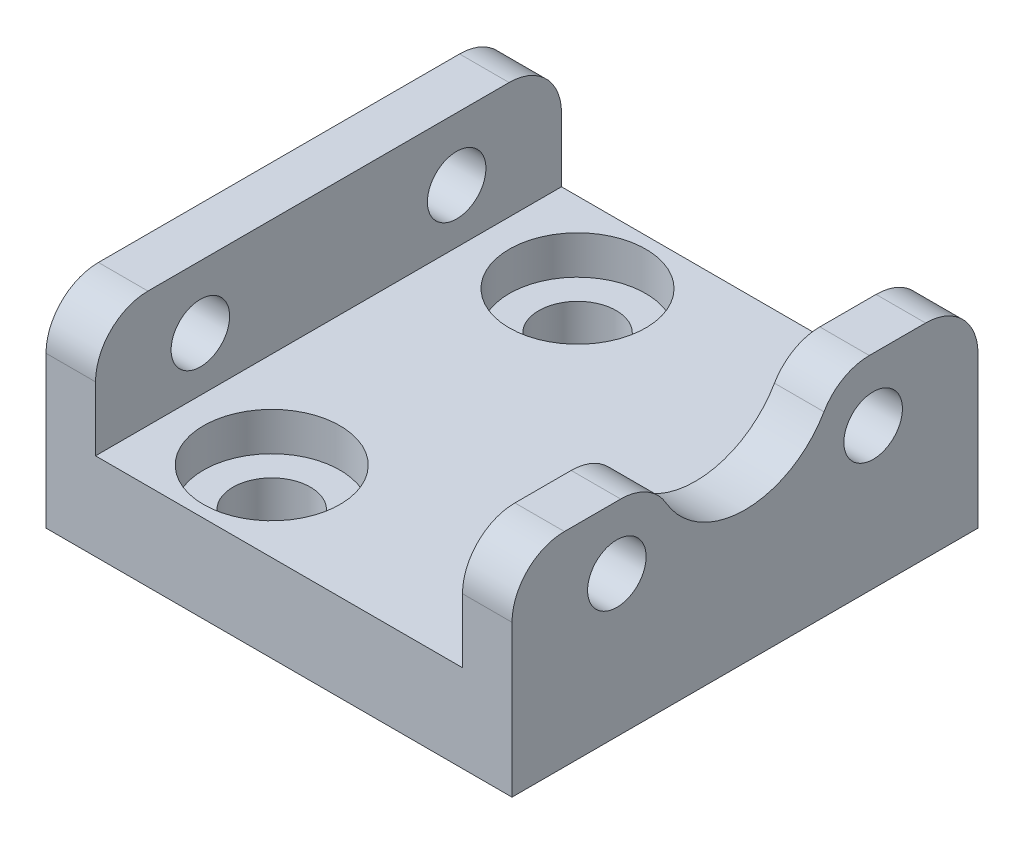
ISO-10303-21;
HEADER;
FILE_DESCRIPTION(('STEP AP214'),'2;1');
FILE_NAME('part.step','',(''),(''),'','','');
FILE_SCHEMA(('AUTOMOTIVE_DESIGN { 1 0 10303 214 1 1 1 1 }'));
ENDSEC;
DATA;
#1=APPLICATION_CONTEXT('core data for automotive mechanical design processes');
#2=APPLICATION_PROTOCOL_DEFINITION('international standard','automotive_design',2000,#1);
#3=PRODUCT_CONTEXT('',#1,'mechanical');
#4=PRODUCT('Part','Part','',(#3));
#5=PRODUCT_RELATED_PRODUCT_CATEGORY('part','',(#4));
#6=PRODUCT_DEFINITION_FORMATION('','',#4);
#7=PRODUCT_DEFINITION_CONTEXT('part definition',#1,'design');
#8=PRODUCT_DEFINITION('design','',#6,#7);
#9=PRODUCT_DEFINITION_SHAPE('','',#8);
#10=(LENGTH_UNIT() NAMED_UNIT(*) SI_UNIT(.MILLI.,.METRE.));
#11=(NAMED_UNIT(*) PLANE_ANGLE_UNIT() SI_UNIT($,.RADIAN.));
#12=(NAMED_UNIT(*) SI_UNIT($,.STERADIAN.) SOLID_ANGLE_UNIT());
#13=UNCERTAINTY_MEASURE_WITH_UNIT(LENGTH_MEASURE(1.E-05),#10,'distance_accuracy_value','');
#14=(GEOMETRIC_REPRESENTATION_CONTEXT(3) GLOBAL_UNCERTAINTY_ASSIGNED_CONTEXT((#13)) GLOBAL_UNIT_ASSIGNED_CONTEXT((#10,
#11,#12)) REPRESENTATION_CONTEXT('',''));
#15=CARTESIAN_POINT('',(0.,0.,0.));
#16=DIRECTION('',(0.,0.,1.));
#17=DIRECTION('',(1.,0.,0.));
#18=AXIS2_PLACEMENT_3D('',#15,#16,#17);
#19=CARTESIAN_POINT('',(0.,17.78,0.));
#20=DIRECTION('',(0.,1.,0.));
#21=DIRECTION('',(0.,0.,1.));
#22=AXIS2_PLACEMENT_3D('',#19,#20,#21);
#23=PLANE('',#22);
#24=DIRECTION('',(0.,0.,-1.));
#25=VECTOR('',#24,1.);
#26=CARTESIAN_POINT('',(40.64,17.78,0.));
#27=LINE('',#26,#25);
#28=CARTESIAN_POINT('',(40.64,17.78,36.068));
#29=VERTEX_POINT('',#28);
#30=CARTESIAN_POINT('',(40.64,17.78,31.1615412763114));
#31=VERTEX_POINT('',#30);
#32=EDGE_CURVE('E159',#29,#31,#27,.T.);
#33=ORIENTED_EDGE('',*,*,#32,.T.);
#34=DIRECTION('',(-1.,0.,0.));
#35=VECTOR('',#34,1.);
#36=CARTESIAN_POINT('',(36.322,17.78,31.1615412763114));
#37=LINE('',#36,#35);
#38=CARTESIAN_POINT('',(36.322,17.78,31.1615412763114));
#39=VERTEX_POINT('',#38);
#40=EDGE_CURVE('E223',#31,#39,#37,.T.);
#41=ORIENTED_EDGE('',*,*,#40,.T.);
#42=DIRECTION('',(0.,0.,1.));
#43=VECTOR('',#42,1.);
#44=CARTESIAN_POINT('',(36.322,17.78,0.));
#45=LINE('',#44,#43);
#46=CARTESIAN_POINT('',(36.322,17.78,36.068));
#47=VERTEX_POINT('',#46);
#48=EDGE_CURVE('E174',#39,#47,#45,.T.);
#49=ORIENTED_EDGE('',*,*,#48,.T.);
#50=DIRECTION('',(1.,0.,0.));
#51=VECTOR('',#50,1.);
#52=CARTESIAN_POINT('',(40.64,17.78,36.068));
#53=LINE('',#52,#51);
#54=EDGE_CURVE('E217',#47,#29,#53,.T.);
#55=ORIENTED_EDGE('',*,*,#54,.T.);
#56=EDGE_LOOP('',(#33,#41,#49,#55));
#57=FACE_BOUND('',#56,.T.);
#58=ADVANCED_FACE('F34',(#57),#23,.T.);
#59=CARTESIAN_POINT('',(0.,7.62,0.));
#60=DIRECTION('',(0.,1.,0.));
#61=DIRECTION('',(0.,0.,1.));
#62=AXIS2_PLACEMENT_3D('',#59,#60,#61);
#63=PLANE('',#62);
#64=CARTESIAN_POINT('',(12.7,7.62,6.985));
#65=DIRECTION('',(0.,1.,0.));
#66=DIRECTION('',(0.,0.,1.));
#67=AXIS2_PLACEMENT_3D('',#64,#65,#66);
#68=CIRCLE('',#67,5.95376);
#69=CARTESIAN_POINT('',(12.7,7.62,12.93876));
#70=VERTEX_POINT('',#69);
#71=EDGE_CURVE('E314',#70,#70,#68,.T.);
#72=ORIENTED_EDGE('',*,*,#71,.F.);
#73=EDGE_LOOP('',(#72));
#74=FACE_BOUND('',#73,.T.);
#75=CARTESIAN_POINT('',(12.7,7.62,33.655));
#76=DIRECTION('',(0.,1.,0.));
#77=DIRECTION('',(0.,0.,1.));
#78=AXIS2_PLACEMENT_3D('',#75,#76,#77);
#79=CIRCLE('',#78,5.95376);
#80=CARTESIAN_POINT('',(12.7,7.62,39.60876));
#81=VERTEX_POINT('',#80);
#82=EDGE_CURVE('E330',#81,#81,#79,.T.);
#83=ORIENTED_EDGE('',*,*,#82,.F.);
#84=EDGE_LOOP('',(#83));
#85=FACE_BOUND('',#84,.T.);
#86=DIRECTION('',(1.,0.,0.));
#87=VECTOR('',#86,1.);
#88=CARTESIAN_POINT('',(0.,7.62,40.64));
#89=LINE('',#88,#87);
#90=CARTESIAN_POINT('',(4.31800000000001,7.62,40.64));
#91=VERTEX_POINT('',#90);
#92=CARTESIAN_POINT('',(36.322,7.62,40.64));
#93=VERTEX_POINT('',#92);
#94=EDGE_CURVE('E169',#91,#93,#89,.T.);
#95=ORIENTED_EDGE('',*,*,#94,.T.);
#96=DIRECTION('',(0.,0.,1.));
#97=VECTOR('',#96,1.);
#98=CARTESIAN_POINT('',(36.322,7.62,0.));
#99=LINE('',#98,#97);
#100=CARTESIAN_POINT('',(36.322,7.62,0.));
#101=VERTEX_POINT('',#100);
#102=EDGE_CURVE('E153',#101,#93,#99,.T.);
#103=ORIENTED_EDGE('',*,*,#102,.F.);
#104=DIRECTION('',(-1.,0.,0.));
#105=VECTOR('',#104,1.);
#106=CARTESIAN_POINT('',(0.,7.62,0.));
#107=LINE('',#106,#105);
#108=CARTESIAN_POINT('',(4.31800000000001,7.62,0.));
#109=VERTEX_POINT('',#108);
#110=EDGE_CURVE('E162',#101,#109,#107,.T.);
#111=ORIENTED_EDGE('',*,*,#110,.T.);
#112=DIRECTION('',(0.,0.,-1.));
#113=VECTOR('',#112,1.);
#114=CARTESIAN_POINT('',(4.31800000000001,7.62,0.));
#115=LINE('',#114,#113);
#116=EDGE_CURVE('E187',#91,#109,#115,.T.);
#117=ORIENTED_EDGE('',*,*,#116,.F.);
#118=EDGE_LOOP('',(#95,#103,#111,#117));
#119=FACE_BOUND('',#118,.T.);
#120=ADVANCED_FACE('F172',(#74,#85,#119),#63,.T.);
#121=CARTESIAN_POINT('',(0.,7.62,0.));
#122=DIRECTION('',(1.,0.,0.));
#123=DIRECTION('',(0.,0.,-1.));
#124=AXIS2_PLACEMENT_3D('',#121,#122,#123);
#125=PLANE('',#124);
#126=CARTESIAN_POINT('',(0.,12.3189999999999,9.14399999999984));
#127=DIRECTION('',(-1.,0.,0.));
#128=DIRECTION('',(0.,0.,1.));
#129=AXIS2_PLACEMENT_3D('',#126,#127,#128);
#130=CIRCLE('',#129,2.5527);
#131=CARTESIAN_POINT('',(0.,12.3189999999999,11.6966999999998));
#132=VERTEX_POINT('',#131);
#133=EDGE_CURVE('E342',#132,#132,#130,.T.);
#134=ORIENTED_EDGE('',*,*,#133,.F.);
#135=EDGE_LOOP('',(#134));
#136=FACE_BOUND('',#135,.T.);
#137=CARTESIAN_POINT('',(0.,12.319,31.496));
#138=DIRECTION('',(-1.,0.,0.));
#139=DIRECTION('',(0.,0.,1.));
#140=AXIS2_PLACEMENT_3D('',#137,#138,#139);
#141=CIRCLE('',#140,2.5527);
#142=CARTESIAN_POINT('',(0.,12.319,34.0487));
#143=VERTEX_POINT('',#142);
#144=EDGE_CURVE('E354',#143,#143,#141,.T.);
#145=ORIENTED_EDGE('',*,*,#144,.F.);
#146=EDGE_LOOP('',(#145));
#147=FACE_BOUND('',#146,.T.);
#148=DIRECTION('',(0.,0.,1.));
#149=VECTOR('',#148,1.);
#150=CARTESIAN_POINT('',(0.,17.78,0.));
#151=LINE('',#150,#149);
#152=CARTESIAN_POINT('',(0.,17.78,4.572));
#153=VERTEX_POINT('',#152);
#154=CARTESIAN_POINT('',(0.,17.78,36.068));
#155=VERTEX_POINT('',#154);
#156=EDGE_CURVE('E188',#153,#155,#151,.T.);
#157=ORIENTED_EDGE('',*,*,#156,.F.);
#158=CARTESIAN_POINT('',(0.,13.208,4.572));
#159=DIRECTION('',(1.,0.,0.));
#160=DIRECTION('',(0.,0.,-1.));
#161=AXIS2_PLACEMENT_3D('',#158,#159,#160);
#162=CIRCLE('',#161,4.572);
#163=CARTESIAN_POINT('',(0.,13.208,0.));
#164=VERTEX_POINT('',#163);
#165=EDGE_CURVE('E266',#153,#164,#162,.F.);
#166=ORIENTED_EDGE('',*,*,#165,.T.);
#167=DIRECTION('',(0.,-1.,0.));
#168=VECTOR('',#167,1.);
#169=CARTESIAN_POINT('',(0.,7.62,0.));
#170=LINE('',#169,#168);
#171=CARTESIAN_POINT('',(0.,0.,0.));
#172=VERTEX_POINT('',#171);
#173=EDGE_CURVE('E168',#164,#172,#170,.T.);
#174=ORIENTED_EDGE('',*,*,#173,.T.);
#175=DIRECTION('',(0.,0.,1.));
#176=VECTOR('',#175,1.);
#177=CARTESIAN_POINT('',(0.,0.,0.));
#178=LINE('',#177,#176);
#179=CARTESIAN_POINT('',(0.,0.,40.64));
#180=VERTEX_POINT('',#179);
#181=EDGE_CURVE('E197',#172,#180,#178,.T.);
#182=ORIENTED_EDGE('',*,*,#181,.T.);
#183=DIRECTION('',(0.,-1.,0.));
#184=VECTOR('',#183,1.);
#185=CARTESIAN_POINT('',(0.,7.62,40.64));
#186=LINE('',#185,#184);
#187=CARTESIAN_POINT('',(0.,13.208,40.64));
#188=VERTEX_POINT('',#187);
#189=EDGE_CURVE('E215',#188,#180,#186,.T.);
#190=ORIENTED_EDGE('',*,*,#189,.F.);
#191=CARTESIAN_POINT('',(0.,13.208,36.068));
#192=DIRECTION('',(1.,0.,0.));
#193=DIRECTION('',(0.,0.,-1.));
#194=AXIS2_PLACEMENT_3D('',#191,#192,#193);
#195=CIRCLE('',#194,4.572);
#196=EDGE_CURVE('E264',#188,#155,#195,.F.);
#197=ORIENTED_EDGE('',*,*,#196,.T.);
#198=EDGE_LOOP('',(#157,#166,#174,#182,#190,#197));
#199=FACE_BOUND('',#198,.T.);
#200=ADVANCED_FACE('F276',(#136,#147,#199),#125,.F.);
#201=CARTESIAN_POINT('',(0.,7.62,40.64));
#202=DIRECTION('',(0.,0.,-1.));
#203=DIRECTION('',(-1.,0.,0.));
#204=AXIS2_PLACEMENT_3D('',#201,#202,#203);
#205=PLANE('',#204);
#206=DIRECTION('',(0.,-1.,0.));
#207=VECTOR('',#206,1.);
#208=CARTESIAN_POINT('',(40.64,7.62,40.64));
#209=LINE('',#208,#207);
#210=CARTESIAN_POINT('',(40.64,13.208,40.64));
#211=VERTEX_POINT('',#210);
#212=CARTESIAN_POINT('',(40.64,0.,40.64));
#213=VERTEX_POINT('',#212);
#214=EDGE_CURVE('E213',#211,#213,#209,.T.);
#215=ORIENTED_EDGE('',*,*,#214,.F.);
#216=DIRECTION('',(1.,0.,0.));
#217=VECTOR('',#216,1.);
#218=CARTESIAN_POINT('',(36.322,13.208,40.64));
#219=LINE('',#218,#217);
#220=CARTESIAN_POINT('',(36.322,13.208,40.64));
#221=VERTEX_POINT('',#220);
#222=EDGE_CURVE('E257',#211,#221,#219,.F.);
#223=ORIENTED_EDGE('',*,*,#222,.T.);
#224=DIRECTION('',(0.,-1.,0.));
#225=VECTOR('',#224,1.);
#226=CARTESIAN_POINT('',(36.322,17.78,40.64));
#227=LINE('',#226,#225);
#228=EDGE_CURVE('E158',#221,#93,#227,.T.);
#229=ORIENTED_EDGE('',*,*,#228,.T.);
#230=ORIENTED_EDGE('',*,*,#94,.F.);
#231=DIRECTION('',(0.,-1.,0.));
#232=VECTOR('',#231,1.);
#233=CARTESIAN_POINT('',(4.31800000000001,17.78,40.64));
#234=LINE('',#233,#232);
#235=CARTESIAN_POINT('',(4.31800000000001,13.208,40.64));
#236=VERTEX_POINT('',#235);
#237=EDGE_CURVE('E195',#236,#91,#234,.T.);
#238=ORIENTED_EDGE('',*,*,#237,.F.);
#239=DIRECTION('',(1.,0.,0.));
#240=VECTOR('',#239,1.);
#241=CARTESIAN_POINT('',(0.,13.208,40.64));
#242=LINE('',#241,#240);
#243=EDGE_CURVE('E255',#236,#188,#242,.F.);
#244=ORIENTED_EDGE('',*,*,#243,.T.);
#245=ORIENTED_EDGE('',*,*,#189,.T.);
#246=DIRECTION('',(1.,0.,0.));
#247=VECTOR('',#246,1.);
#248=CARTESIAN_POINT('',(0.,0.,40.64));
#249=LINE('',#248,#247);
#250=EDGE_CURVE('E202',#180,#213,#249,.T.);
#251=ORIENTED_EDGE('',*,*,#250,.T.);
#252=EDGE_LOOP('',(#215,#223,#229,#230,#238,#244,#245,#251));
#253=FACE_BOUND('',#252,.T.);
#254=ADVANCED_FACE('F271',(#253),#205,.F.);
#255=CARTESIAN_POINT('',(40.64,7.62,0.));
#256=DIRECTION('',(-1.,0.,0.));
#257=DIRECTION('',(0.,0.,1.));
#258=AXIS2_PLACEMENT_3D('',#255,#256,#257);
#259=PLANE('',#258);
#260=CARTESIAN_POINT('',(40.64,12.3189999999999,9.14399999999983));
#261=DIRECTION('',(-1.,0.,0.));
#262=DIRECTION('',(0.,0.,1.));
#263=AXIS2_PLACEMENT_3D('',#260,#261,#262);
#264=CIRCLE('',#263,2.55269999999999);
#265=CARTESIAN_POINT('',(40.64,12.3189999999999,11.6966999999998));
#266=VERTEX_POINT('',#265);
#267=EDGE_CURVE('E345',#266,#266,#264,.T.);
#268=ORIENTED_EDGE('',*,*,#267,.T.);
#269=EDGE_LOOP('',(#268));
#270=FACE_BOUND('',#269,.T.);
#271=CARTESIAN_POINT('',(40.64,12.319,31.496));
#272=DIRECTION('',(-1.,0.,0.));
#273=DIRECTION('',(0.,0.,1.));
#274=AXIS2_PLACEMENT_3D('',#271,#272,#273);
#275=CIRCLE('',#274,2.55269999999999);
#276=CARTESIAN_POINT('',(40.64,12.319,34.0487));
#277=VERTEX_POINT('',#276);
#278=EDGE_CURVE('E220',#277,#277,#275,.T.);
#279=ORIENTED_EDGE('',*,*,#278,.T.);
#280=EDGE_LOOP('',(#279));
#281=FACE_BOUND('',#280,.T.);
#282=CARTESIAN_POINT('',(40.64,19.5045530119415,20.32));
#283=DIRECTION('',(1.,0.,0.));
#284=DIRECTION('',(0.,0.,-1.));
#285=AXIS2_PLACEMENT_3D('',#282,#283,#284);
#286=CIRCLE('',#285,7.96536802834442);
#287=CARTESIAN_POINT('',(40.64,15.5041629829732,27.207958147601));
#288=VERTEX_POINT('',#287);
#289=CARTESIAN_POINT('',(40.64,15.5041629829732,13.432041852399));
#290=VERTEX_POINT('',#289);
#291=EDGE_CURVE('E315',#288,#290,#286,.T.);
#292=ORIENTED_EDGE('',*,*,#291,.F.);
#293=CARTESIAN_POINT('',(40.64,13.208,31.1615412763114));
#294=DIRECTION('',(-1.,0.,0.));
#295=DIRECTION('',(0.,0.,1.));
#296=AXIS2_PLACEMENT_3D('',#293,#294,#295);
#297=CIRCLE('',#296,4.572);
#298=EDGE_CURVE('E243',#288,#31,#297,.F.);
#299=ORIENTED_EDGE('',*,*,#298,.T.);
#300=ORIENTED_EDGE('',*,*,#32,.F.);
#301=CARTESIAN_POINT('',(40.64,13.208,36.068));
#302=DIRECTION('',(-1.,0.,0.));
#303=DIRECTION('',(0.,0.,1.));
#304=AXIS2_PLACEMENT_3D('',#301,#302,#303);
#305=CIRCLE('',#304,4.572);
#306=EDGE_CURVE('E237',#29,#211,#305,.F.);
#307=ORIENTED_EDGE('',*,*,#306,.T.);
#308=ORIENTED_EDGE('',*,*,#214,.T.);
#309=DIRECTION('',(0.,0.,-1.));
#310=VECTOR('',#309,1.);
#311=CARTESIAN_POINT('',(40.64,0.,0.));
#312=LINE('',#311,#310);
#313=CARTESIAN_POINT('',(40.64,0.,0.));
#314=VERTEX_POINT('',#313);
#315=EDGE_CURVE('E205',#213,#314,#312,.T.);
#316=ORIENTED_EDGE('',*,*,#315,.T.);
#317=DIRECTION('',(0.,-1.,0.));
#318=VECTOR('',#317,1.);
#319=CARTESIAN_POINT('',(40.64,7.62,0.));
#320=LINE('',#319,#318);
#321=CARTESIAN_POINT('',(40.64,13.208,0.));
#322=VERTEX_POINT('',#321);
#323=EDGE_CURVE('E211',#322,#314,#320,.T.);
#324=ORIENTED_EDGE('',*,*,#323,.F.);
#325=CARTESIAN_POINT('',(40.64,13.208,4.572));
#326=DIRECTION('',(-1.,0.,0.));
#327=DIRECTION('',(0.,0.,1.));
#328=AXIS2_PLACEMENT_3D('',#325,#326,#327);
#329=CIRCLE('',#328,4.572);
#330=CARTESIAN_POINT('',(40.64,17.78,4.572));
#331=VERTEX_POINT('',#330);
#332=EDGE_CURVE('E239',#322,#331,#329,.F.);
#333=ORIENTED_EDGE('',*,*,#332,.T.);
#334=CARTESIAN_POINT('',(40.64,17.78,9.47845872368865));
#335=VERTEX_POINT('',#334);
#336=EDGE_CURVE('E184',#335,#331,#27,.T.);
#337=ORIENTED_EDGE('',*,*,#336,.F.);
#338=CARTESIAN_POINT('',(40.64,13.208,9.47845872368865));
#339=DIRECTION('',(-1.,0.,0.));
#340=DIRECTION('',(0.,0.,1.));
#341=AXIS2_PLACEMENT_3D('',#338,#339,#340);
#342=CIRCLE('',#341,4.572);
#343=EDGE_CURVE('E241',#335,#290,#342,.F.);
#344=ORIENTED_EDGE('',*,*,#343,.T.);
#345=EDGE_LOOP('',(#292,#299,#300,#307,#308,#316,#324,#333,#337,#344));
#346=FACE_BOUND('',#345,.T.);
#347=ADVANCED_FACE('F368',(#270,#281,#346),#259,.F.);
#348=CARTESIAN_POINT('',(0.,7.62,0.));
#349=DIRECTION('',(0.,0.,1.));
#350=DIRECTION('',(1.,0.,0.));
#351=AXIS2_PLACEMENT_3D('',#348,#349,#350);
#352=PLANE('',#351);
#353=DIRECTION('',(0.,-1.,0.));
#354=VECTOR('',#353,1.);
#355=CARTESIAN_POINT('',(36.322,17.78,0.));
#356=LINE('',#355,#354);
#357=CARTESIAN_POINT('',(36.322,13.208,0.));
#358=VERTEX_POINT('',#357);
#359=EDGE_CURVE('E147',#358,#101,#356,.T.);
#360=ORIENTED_EDGE('',*,*,#359,.F.);
#361=DIRECTION('',(-1.,0.,0.));
#362=VECTOR('',#361,1.);
#363=CARTESIAN_POINT('',(40.64,13.208,0.));
#364=LINE('',#363,#362);
#365=EDGE_CURVE('E253',#358,#322,#364,.F.);
#366=ORIENTED_EDGE('',*,*,#365,.T.);
#367=ORIENTED_EDGE('',*,*,#323,.T.);
#368=DIRECTION('',(-1.,0.,0.));
#369=VECTOR('',#368,1.);
#370=CARTESIAN_POINT('',(0.,0.,0.));
#371=LINE('',#370,#369);
#372=EDGE_CURVE('E198',#314,#172,#371,.T.);
#373=ORIENTED_EDGE('',*,*,#372,.T.);
#374=ORIENTED_EDGE('',*,*,#173,.F.);
#375=DIRECTION('',(-1.,0.,0.));
#376=VECTOR('',#375,1.);
#377=CARTESIAN_POINT('',(4.31800000000001,13.208,0.));
#378=LINE('',#377,#376);
#379=CARTESIAN_POINT('',(4.31800000000001,13.208,0.));
#380=VERTEX_POINT('',#379);
#381=EDGE_CURVE('E251',#164,#380,#378,.F.);
#382=ORIENTED_EDGE('',*,*,#381,.T.);
#383=DIRECTION('',(0.,-1.,0.));
#384=VECTOR('',#383,1.);
#385=CARTESIAN_POINT('',(4.31800000000001,17.78,0.));
#386=LINE('',#385,#384);
#387=EDGE_CURVE('E164',#380,#109,#386,.T.);
#388=ORIENTED_EDGE('',*,*,#387,.T.);
#389=ORIENTED_EDGE('',*,*,#110,.F.);
#390=EDGE_LOOP('',(#360,#366,#367,#373,#374,#382,#388,#389));
#391=FACE_BOUND('',#390,.T.);
#392=ADVANCED_FACE('F163',(#391),#352,.F.);
#393=CARTESIAN_POINT('',(0.,0.,0.));
#394=DIRECTION('',(0.,1.,0.));
#395=DIRECTION('',(0.,0.,1.));
#396=AXIS2_PLACEMENT_3D('',#393,#394,#395);
#397=PLANE('',#396);
#398=CARTESIAN_POINT('',(12.7,0.,6.985));
#399=DIRECTION('',(0.,1.,0.));
#400=DIRECTION('',(0.,0.,1.));
#401=AXIS2_PLACEMENT_3D('',#398,#399,#400);
#402=CIRCLE('',#401,3.3782);
#403=CARTESIAN_POINT('',(12.7,0.,10.3632));
#404=VERTEX_POINT('',#403);
#405=EDGE_CURVE('E327',#404,#404,#402,.T.);
#406=ORIENTED_EDGE('',*,*,#405,.T.);
#407=EDGE_LOOP('',(#406));
#408=FACE_BOUND('',#407,.T.);
#409=CARTESIAN_POINT('',(12.7,0.,33.655));
#410=DIRECTION('',(0.,1.,0.));
#411=DIRECTION('',(0.,0.,1.));
#412=AXIS2_PLACEMENT_3D('',#409,#410,#411);
#413=CIRCLE('',#412,3.3782);
#414=CARTESIAN_POINT('',(12.7,0.,37.0332));
#415=VERTEX_POINT('',#414);
#416=EDGE_CURVE('E339',#415,#415,#413,.T.);
#417=ORIENTED_EDGE('',*,*,#416,.T.);
#418=EDGE_LOOP('',(#417));
#419=FACE_BOUND('',#418,.T.);
#420=ORIENTED_EDGE('',*,*,#181,.F.);
#421=ORIENTED_EDGE('',*,*,#372,.F.);
#422=ORIENTED_EDGE('',*,*,#315,.F.);
#423=ORIENTED_EDGE('',*,*,#250,.F.);
#424=EDGE_LOOP('',(#420,#421,#422,#423));
#425=FACE_BOUND('',#424,.T.);
#426=ADVANCED_FACE('F290',(#408,#419,#425),#397,.F.);
#427=CARTESIAN_POINT('',(4.31800000000001,17.78,0.));
#428=DIRECTION('',(-1.,0.,0.));
#429=DIRECTION('',(0.,0.,1.));
#430=AXIS2_PLACEMENT_3D('',#427,#428,#429);
#431=PLANE('',#430);
#432=CARTESIAN_POINT('',(4.31800000000001,12.3189999999999,9.14399999999984));
#433=DIRECTION('',(-1.,0.,0.));
#434=DIRECTION('',(0.,0.,1.));
#435=AXIS2_PLACEMENT_3D('',#432,#433,#434);
#436=CIRCLE('',#435,2.5527);
#437=CARTESIAN_POINT('',(4.31800000000001,12.3189999999999,11.6966999999998));
#438=VERTEX_POINT('',#437);
#439=EDGE_CURVE('E348',#438,#438,#436,.T.);
#440=ORIENTED_EDGE('',*,*,#439,.T.);
#441=EDGE_LOOP('',(#440));
#442=FACE_BOUND('',#441,.T.);
#443=CARTESIAN_POINT('',(4.31800000000001,12.319,31.496));
#444=DIRECTION('',(-1.,0.,0.));
#445=DIRECTION('',(0.,0.,1.));
#446=AXIS2_PLACEMENT_3D('',#443,#444,#445);
#447=CIRCLE('',#446,2.5527);
#448=CARTESIAN_POINT('',(4.31800000000001,12.319,34.0487));
#449=VERTEX_POINT('',#448);
#450=EDGE_CURVE('E181',#449,#449,#447,.T.);
#451=ORIENTED_EDGE('',*,*,#450,.T.);
#452=EDGE_LOOP('',(#451));
#453=FACE_BOUND('',#452,.T.);
#454=ORIENTED_EDGE('',*,*,#387,.F.);
#455=CARTESIAN_POINT('',(4.31800000000001,13.208,4.572));
#456=DIRECTION('',(-1.,0.,0.));
#457=DIRECTION('',(0.,0.,1.));
#458=AXIS2_PLACEMENT_3D('',#455,#456,#457);
#459=CIRCLE('',#458,4.572);
#460=CARTESIAN_POINT('',(4.31800000000001,17.78,4.572));
#461=VERTEX_POINT('',#460);
#462=EDGE_CURVE('E11',#380,#461,#459,.F.);
#463=ORIENTED_EDGE('',*,*,#462,.T.);
#464=DIRECTION('',(0.,0.,-1.));
#465=VECTOR('',#464,1.);
#466=CARTESIAN_POINT('',(4.31800000000001,17.78,0.));
#467=LINE('',#466,#465);
#468=CARTESIAN_POINT('',(4.31800000000001,17.78,36.068));
#469=VERTEX_POINT('',#468);
#470=EDGE_CURVE('E191',#469,#461,#467,.T.);
#471=ORIENTED_EDGE('',*,*,#470,.F.);
#472=CARTESIAN_POINT('',(4.31800000000001,13.208,36.068));
#473=DIRECTION('',(-1.,0.,0.));
#474=DIRECTION('',(0.,0.,1.));
#475=AXIS2_PLACEMENT_3D('',#472,#473,#474);
#476=CIRCLE('',#475,4.572);
#477=EDGE_CURVE('E42',#469,#236,#476,.F.);
#478=ORIENTED_EDGE('',*,*,#477,.T.);
#479=ORIENTED_EDGE('',*,*,#237,.T.);
#480=ORIENTED_EDGE('',*,*,#116,.T.);
#481=EDGE_LOOP('',(#454,#463,#471,#478,#479,#480));
#482=FACE_BOUND('',#481,.T.);
#483=ADVANCED_FACE('F268',(#442,#453,#482),#431,.F.);
#484=CARTESIAN_POINT('',(0.,17.78,0.));
#485=DIRECTION('',(0.,1.,0.));
#486=DIRECTION('',(0.,0.,1.));
#487=AXIS2_PLACEMENT_3D('',#484,#485,#486);
#488=PLANE('',#487);
#489=ORIENTED_EDGE('',*,*,#470,.T.);
#490=DIRECTION('',(-1.,0.,0.));
#491=VECTOR('',#490,1.);
#492=CARTESIAN_POINT('',(0.,17.78,4.572));
#493=LINE('',#492,#491);
#494=EDGE_CURVE('E261',#461,#153,#493,.T.);
#495=ORIENTED_EDGE('',*,*,#494,.T.);
#496=ORIENTED_EDGE('',*,*,#156,.T.);
#497=DIRECTION('',(1.,0.,0.));
#498=VECTOR('',#497,1.);
#499=CARTESIAN_POINT('',(4.31800000000001,17.78,36.068));
#500=LINE('',#499,#498);
#501=EDGE_CURVE('E259',#155,#469,#500,.T.);
#502=ORIENTED_EDGE('',*,*,#501,.T.);
#503=EDGE_LOOP('',(#489,#495,#496,#502));
#504=FACE_BOUND('',#503,.T.);
#505=ADVANCED_FACE('F278',(#504),#488,.T.);
#506=CARTESIAN_POINT('',(36.322,17.78,0.));
#507=DIRECTION('',(1.,0.,0.));
#508=DIRECTION('',(0.,0.,-1.));
#509=AXIS2_PLACEMENT_3D('',#506,#507,#508);
#510=PLANE('',#509);
#511=CARTESIAN_POINT('',(36.322,12.3189999999999,9.14399999999983));
#512=DIRECTION('',(1.,0.,0.));
#513=DIRECTION('',(0.,0.,-1.));
#514=AXIS2_PLACEMENT_3D('',#511,#512,#513);
#515=CIRCLE('',#514,2.5527);
#516=CARTESIAN_POINT('',(36.322,12.3189999999999,6.59129999999984));
#517=VERTEX_POINT('',#516);
#518=EDGE_CURVE('E351',#517,#517,#515,.T.);
#519=ORIENTED_EDGE('',*,*,#518,.T.);
#520=EDGE_LOOP('',(#519));
#521=FACE_BOUND('',#520,.T.);
#522=CARTESIAN_POINT('',(36.322,12.319,31.496));
#523=DIRECTION('',(1.,0.,0.));
#524=DIRECTION('',(0.,0.,-1.));
#525=AXIS2_PLACEMENT_3D('',#522,#523,#524);
#526=CIRCLE('',#525,2.5527);
#527=CARTESIAN_POINT('',(36.322,12.319,28.9433));
#528=VERTEX_POINT('',#527);
#529=EDGE_CURVE('E175',#528,#528,#526,.T.);
#530=ORIENTED_EDGE('',*,*,#529,.T.);
#531=EDGE_LOOP('',(#530));
#532=FACE_BOUND('',#531,.T.);
#533=ORIENTED_EDGE('',*,*,#48,.F.);
#534=CARTESIAN_POINT('',(36.322,13.208,31.1615412763114));
#535=DIRECTION('',(1.,0.,0.));
#536=DIRECTION('',(0.,0.,-1.));
#537=AXIS2_PLACEMENT_3D('',#534,#535,#536);
#538=CIRCLE('',#537,4.572);
#539=CARTESIAN_POINT('',(36.322,15.5041629829732,27.207958147601));
#540=VERTEX_POINT('',#539);
#541=EDGE_CURVE('E231',#39,#540,#538,.F.);
#542=ORIENTED_EDGE('',*,*,#541,.T.);
#543=CARTESIAN_POINT('',(36.322,19.5045530119415,20.32));
#544=DIRECTION('',(1.,0.,0.));
#545=DIRECTION('',(0.,0.,-1.));
#546=AXIS2_PLACEMENT_3D('',#543,#544,#545);
#547=CIRCLE('',#546,7.96536802834442);
#548=CARTESIAN_POINT('',(36.322,15.5041629829732,13.432041852399));
#549=VERTEX_POINT('',#548);
#550=EDGE_CURVE('E307',#549,#540,#547,.F.);
#551=ORIENTED_EDGE('',*,*,#550,.F.);
#552=CARTESIAN_POINT('',(36.322,13.208,9.47845872368865));
#553=DIRECTION('',(1.,0.,0.));
#554=DIRECTION('',(0.,0.,-1.));
#555=AXIS2_PLACEMENT_3D('',#552,#553,#554);
#556=CIRCLE('',#555,4.572);
#557=CARTESIAN_POINT('',(36.322,17.78,9.47845872368865));
#558=VERTEX_POINT('',#557);
#559=EDGE_CURVE('E229',#549,#558,#556,.F.);
#560=ORIENTED_EDGE('',*,*,#559,.T.);
#561=CARTESIAN_POINT('',(36.322,17.78,4.572));
#562=VERTEX_POINT('',#561);
#563=EDGE_CURVE('E178',#562,#558,#45,.T.);
#564=ORIENTED_EDGE('',*,*,#563,.F.);
#565=CARTESIAN_POINT('',(36.322,13.208,4.572));
#566=DIRECTION('',(1.,0.,0.));
#567=DIRECTION('',(0.,0.,-1.));
#568=AXIS2_PLACEMENT_3D('',#565,#566,#567);
#569=CIRCLE('',#568,4.572);
#570=EDGE_CURVE('E155',#562,#358,#569,.F.);
#571=ORIENTED_EDGE('',*,*,#570,.T.);
#572=ORIENTED_EDGE('',*,*,#359,.T.);
#573=ORIENTED_EDGE('',*,*,#102,.T.);
#574=ORIENTED_EDGE('',*,*,#228,.F.);
#575=CARTESIAN_POINT('',(36.322,13.208,36.068));
#576=DIRECTION('',(1.,0.,0.));
#577=DIRECTION('',(0.,0.,-1.));
#578=AXIS2_PLACEMENT_3D('',#575,#576,#577);
#579=CIRCLE('',#578,4.572);
#580=EDGE_CURVE('E226',#221,#47,#579,.F.);
#581=ORIENTED_EDGE('',*,*,#580,.T.);
#582=EDGE_LOOP('',(#533,#542,#551,#560,#564,#571,#572,#573,#574,#581));
#583=FACE_BOUND('',#582,.T.);
#584=ADVANCED_FACE('F150',(#521,#532,#583),#510,.F.);
#585=ORIENTED_EDGE('',*,*,#563,.T.);
#586=DIRECTION('',(-1.,0.,0.));
#587=VECTOR('',#586,1.);
#588=CARTESIAN_POINT('',(40.64,17.78,9.47845872368865));
#589=LINE('',#588,#587);
#590=EDGE_CURVE('E248',#558,#335,#589,.F.);
#591=ORIENTED_EDGE('',*,*,#590,.T.);
#592=ORIENTED_EDGE('',*,*,#336,.T.);
#593=DIRECTION('',(-1.,0.,0.));
#594=VECTOR('',#593,1.);
#595=CARTESIAN_POINT('',(36.322,17.78,4.572));
#596=LINE('',#595,#594);
#597=EDGE_CURVE('E245',#331,#562,#596,.T.);
#598=ORIENTED_EDGE('',*,*,#597,.T.);
#599=EDGE_LOOP('',(#585,#591,#592,#598));
#600=FACE_BOUND('',#599,.T.);
#601=ADVANCED_FACE('F364',(#600),#23,.T.);
#602=CARTESIAN_POINT('',(0.,12.319,31.496));
#603=DIRECTION('',(-1.,0.,0.));
#604=DIRECTION('',(0.,0.,1.));
#605=AXIS2_PLACEMENT_3D('',#602,#603,#604);
#606=CYLINDRICAL_SURFACE('',#605,2.5527);
#607=ORIENTED_EDGE('',*,*,#144,.T.);
#608=EDGE_LOOP('',(#607));
#609=FACE_BOUND('',#608,.T.);
#610=ORIENTED_EDGE('',*,*,#450,.F.);
#611=EDGE_LOOP('',(#610));
#612=FACE_BOUND('',#611,.T.);
#613=ADVANCED_FACE('F389',(#609,#612),#606,.F.);
#614=ORIENTED_EDGE('',*,*,#278,.F.);
#615=EDGE_LOOP('',(#614));
#616=FACE_BOUND('',#615,.T.);
#617=ORIENTED_EDGE('',*,*,#529,.F.);
#618=EDGE_LOOP('',(#617));
#619=FACE_BOUND('',#618,.T.);
#620=ADVANCED_FACE('F394',(#616,#619),#606,.F.);
#621=CARTESIAN_POINT('',(0.,12.3189999999999,9.14399999999984));
#622=DIRECTION('',(-1.,0.,0.));
#623=DIRECTION('',(0.,0.,1.));
#624=AXIS2_PLACEMENT_3D('',#621,#622,#623);
#625=CYLINDRICAL_SURFACE('',#624,2.5527);
#626=ORIENTED_EDGE('',*,*,#267,.F.);
#627=EDGE_LOOP('',(#626));
#628=FACE_BOUND('',#627,.T.);
#629=ORIENTED_EDGE('',*,*,#518,.F.);
#630=EDGE_LOOP('',(#629));
#631=FACE_BOUND('',#630,.T.);
#632=ADVANCED_FACE('F442',(#628,#631),#625,.F.);
#633=ORIENTED_EDGE('',*,*,#133,.T.);
#634=EDGE_LOOP('',(#633));
#635=FACE_BOUND('',#634,.T.);
#636=ORIENTED_EDGE('',*,*,#439,.F.);
#637=EDGE_LOOP('',(#636));
#638=FACE_BOUND('',#637,.T.);
#639=ADVANCED_FACE('F418',(#635,#638),#625,.F.);
#640=CARTESIAN_POINT('',(12.7,7.62,33.655));
#641=DIRECTION('',(0.,1.,0.));
#642=DIRECTION('',(0.,0.,1.));
#643=AXIS2_PLACEMENT_3D('',#640,#641,#642);
#644=CYLINDRICAL_SURFACE('',#643,3.3782);
#645=ORIENTED_EDGE('',*,*,#416,.F.);
#646=EDGE_LOOP('',(#645));
#647=FACE_BOUND('',#646,.T.);
#648=CARTESIAN_POINT('',(12.7,4.2672,33.655));
#649=DIRECTION('',(0.,1.,0.));
#650=DIRECTION('',(0.,0.,1.));
#651=AXIS2_PLACEMENT_3D('',#648,#649,#650);
#652=CIRCLE('',#651,3.3782);
#653=CARTESIAN_POINT('',(12.7,4.2672,37.0332));
#654=VERTEX_POINT('',#653);
#655=EDGE_CURVE('E336',#654,#654,#652,.T.);
#656=ORIENTED_EDGE('',*,*,#655,.T.);
#657=EDGE_LOOP('',(#656));
#658=FACE_BOUND('',#657,.T.);
#659=ADVANCED_FACE('F414',(#647,#658),#644,.F.);
#660=CARTESIAN_POINT('',(16.0782,4.2672,33.655));
#661=DIRECTION('',(0.,-1.,0.));
#662=DIRECTION('',(0.,0.,-1.));
#663=AXIS2_PLACEMENT_3D('',#660,#661,#662);
#664=PLANE('',#663);
#665=ORIENTED_EDGE('',*,*,#655,.F.);
#666=EDGE_LOOP('',(#665));
#667=FACE_BOUND('',#666,.T.);
#668=CARTESIAN_POINT('',(12.7,4.2672,33.655));
#669=DIRECTION('',(0.,1.,0.));
#670=DIRECTION('',(0.,0.,1.));
#671=AXIS2_PLACEMENT_3D('',#668,#669,#670);
#672=CIRCLE('',#671,5.95376);
#673=CARTESIAN_POINT('',(12.7,4.2672,39.60876));
#674=VERTEX_POINT('',#673);
#675=EDGE_CURVE('E333',#674,#674,#672,.T.);
#676=ORIENTED_EDGE('',*,*,#675,.T.);
#677=EDGE_LOOP('',(#676));
#678=FACE_BOUND('',#677,.T.);
#679=ADVANCED_FACE('F417',(#667,#678),#664,.F.);
#680=CARTESIAN_POINT('',(12.7,7.62,33.655));
#681=DIRECTION('',(0.,1.,0.));
#682=DIRECTION('',(0.,0.,1.));
#683=AXIS2_PLACEMENT_3D('',#680,#681,#682);
#684=CYLINDRICAL_SURFACE('',#683,5.95376);
#685=ORIENTED_EDGE('',*,*,#675,.F.);
#686=EDGE_LOOP('',(#685));
#687=FACE_BOUND('',#686,.T.);
#688=ORIENTED_EDGE('',*,*,#82,.T.);
#689=EDGE_LOOP('',(#688));
#690=FACE_BOUND('',#689,.T.);
#691=ADVANCED_FACE('F424',(#687,#690),#684,.F.);
#692=CARTESIAN_POINT('',(12.7,7.62,6.985));
#693=DIRECTION('',(0.,1.,0.));
#694=DIRECTION('',(0.,0.,1.));
#695=AXIS2_PLACEMENT_3D('',#692,#693,#694);
#696=CYLINDRICAL_SURFACE('',#695,3.3782);
#697=ORIENTED_EDGE('',*,*,#405,.F.);
#698=EDGE_LOOP('',(#697));
#699=FACE_BOUND('',#698,.T.);
#700=CARTESIAN_POINT('',(12.7,4.2672,6.985));
#701=DIRECTION('',(0.,1.,0.));
#702=DIRECTION('',(0.,0.,1.));
#703=AXIS2_PLACEMENT_3D('',#700,#701,#702);
#704=CIRCLE('',#703,3.3782);
#705=CARTESIAN_POINT('',(12.7,4.2672,10.3632));
#706=VERTEX_POINT('',#705);
#707=EDGE_CURVE('E324',#706,#706,#704,.T.);
#708=ORIENTED_EDGE('',*,*,#707,.T.);
#709=EDGE_LOOP('',(#708));
#710=FACE_BOUND('',#709,.T.);
#711=ADVANCED_FACE('F430',(#699,#710),#696,.F.);
#712=CARTESIAN_POINT('',(16.0782,4.2672,6.985));
#713=DIRECTION('',(0.,-1.,0.));
#714=DIRECTION('',(0.,0.,-1.));
#715=AXIS2_PLACEMENT_3D('',#712,#713,#714);
#716=PLANE('',#715);
#717=ORIENTED_EDGE('',*,*,#707,.F.);
#718=EDGE_LOOP('',(#717));
#719=FACE_BOUND('',#718,.T.);
#720=CARTESIAN_POINT('',(12.7,4.2672,6.985));
#721=DIRECTION('',(0.,1.,0.));
#722=DIRECTION('',(0.,0.,1.));
#723=AXIS2_PLACEMENT_3D('',#720,#721,#722);
#724=CIRCLE('',#723,5.95376);
#725=CARTESIAN_POINT('',(12.7,4.2672,12.93876));
#726=VERTEX_POINT('',#725);
#727=EDGE_CURVE('E318',#726,#726,#724,.T.);
#728=ORIENTED_EDGE('',*,*,#727,.T.);
#729=EDGE_LOOP('',(#728));
#730=FACE_BOUND('',#729,.T.);
#731=ADVANCED_FACE('F437',(#719,#730),#716,.F.);
#732=CARTESIAN_POINT('',(12.7,7.62,6.985));
#733=DIRECTION('',(0.,1.,0.));
#734=DIRECTION('',(0.,0.,1.));
#735=AXIS2_PLACEMENT_3D('',#732,#733,#734);
#736=CYLINDRICAL_SURFACE('',#735,5.95376);
#737=ORIENTED_EDGE('',*,*,#727,.F.);
#738=EDGE_LOOP('',(#737));
#739=FACE_BOUND('',#738,.T.);
#740=ORIENTED_EDGE('',*,*,#71,.T.);
#741=EDGE_LOOP('',(#740));
#742=FACE_BOUND('',#741,.T.);
#743=ADVANCED_FACE('F492',(#739,#742),#736,.F.);
#744=CARTESIAN_POINT('',(-0.00100000000000794,19.5045530119415,20.32));
#745=DIRECTION('',(1.,0.,0.));
#746=DIRECTION('',(0.,0.,-1.));
#747=AXIS2_PLACEMENT_3D('',#744,#745,#746);
#748=CYLINDRICAL_SURFACE('',#747,7.96536802834442);
#749=ORIENTED_EDGE('',*,*,#550,.T.);
#750=DIRECTION('',(1.,0.,0.));
#751=VECTOR('',#750,1.);
#752=CARTESIAN_POINT('',(-0.00100000000000676,15.5041629829732,27.207958147601));
#753=LINE('',#752,#751);
#754=EDGE_CURVE('E235',#540,#288,#753,.T.);
#755=ORIENTED_EDGE('',*,*,#754,.T.);
#756=ORIENTED_EDGE('',*,*,#291,.T.);
#757=DIRECTION('',(1.,0.,0.));
#758=VECTOR('',#757,1.);
#759=CARTESIAN_POINT('',(-0.00100000000000912,15.5041629829732,13.432041852399));
#760=LINE('',#759,#758);
#761=EDGE_CURVE('E233',#290,#549,#760,.F.);
#762=ORIENTED_EDGE('',*,*,#761,.T.);
#763=EDGE_LOOP('',(#749,#755,#756,#762));
#764=FACE_BOUND('',#763,.T.);
#765=ADVANCED_FACE('F310',(#764),#748,.F.);
#766=CARTESIAN_POINT('',(-0.00100000000000609,13.208,31.1615412763114));
#767=DIRECTION('',(1.,0.,0.));
#768=DIRECTION('',(0.,0.,-1.));
#769=AXIS2_PLACEMENT_3D('',#766,#767,#768);
#770=CYLINDRICAL_SURFACE('',#769,4.572);
#771=ORIENTED_EDGE('',*,*,#298,.F.);
#772=ORIENTED_EDGE('',*,*,#754,.F.);
#773=ORIENTED_EDGE('',*,*,#541,.F.);
#774=ORIENTED_EDGE('',*,*,#40,.F.);
#775=EDGE_LOOP('',(#771,#772,#773,#774));
#776=FACE_BOUND('',#775,.T.);
#777=ADVANCED_FACE('F303',(#776),#770,.T.);
#778=CARTESIAN_POINT('',(-0.00100000000000979,13.208,9.47845872368866));
#779=DIRECTION('',(1.,0.,0.));
#780=DIRECTION('',(0.,0.,-1.));
#781=AXIS2_PLACEMENT_3D('',#778,#779,#780);
#782=CYLINDRICAL_SURFACE('',#781,4.572);
#783=ORIENTED_EDGE('',*,*,#559,.F.);
#784=ORIENTED_EDGE('',*,*,#761,.F.);
#785=ORIENTED_EDGE('',*,*,#343,.F.);
#786=ORIENTED_EDGE('',*,*,#590,.F.);
#787=EDGE_LOOP('',(#783,#784,#785,#786));
#788=FACE_BOUND('',#787,.T.);
#789=ADVANCED_FACE('F573',(#788),#782,.T.);
#790=CARTESIAN_POINT('',(0.,13.208,4.572));
#791=DIRECTION('',(1.,0.,0.));
#792=DIRECTION('',(0.,0.,-1.));
#793=AXIS2_PLACEMENT_3D('',#790,#791,#792);
#794=CYLINDRICAL_SURFACE('',#793,4.572);
#795=ORIENTED_EDGE('',*,*,#332,.F.);
#796=ORIENTED_EDGE('',*,*,#365,.F.);
#797=ORIENTED_EDGE('',*,*,#570,.F.);
#798=ORIENTED_EDGE('',*,*,#597,.F.);
#799=EDGE_LOOP('',(#795,#796,#797,#798));
#800=FACE_BOUND('',#799,.T.);
#801=ADVANCED_FACE('F367',(#800),#794,.T.);
#802=CARTESIAN_POINT('',(0.,13.208,36.068));
#803=DIRECTION('',(-1.,0.,0.));
#804=DIRECTION('',(0.,0.,1.));
#805=AXIS2_PLACEMENT_3D('',#802,#803,#804);
#806=CYLINDRICAL_SURFACE('',#805,4.572);
#807=ORIENTED_EDGE('',*,*,#580,.F.);
#808=ORIENTED_EDGE('',*,*,#222,.F.);
#809=ORIENTED_EDGE('',*,*,#306,.F.);
#810=ORIENTED_EDGE('',*,*,#54,.F.);
#811=EDGE_LOOP('',(#807,#808,#809,#810));
#812=FACE_BOUND('',#811,.T.);
#813=ADVANCED_FACE('F295',(#812),#806,.T.);
#814=CARTESIAN_POINT('',(0.,13.208,4.572));
#815=DIRECTION('',(1.,0.,0.));
#816=DIRECTION('',(0.,0.,-1.));
#817=AXIS2_PLACEMENT_3D('',#814,#815,#816);
#818=CYLINDRICAL_SURFACE('',#817,4.572);
#819=ORIENTED_EDGE('',*,*,#462,.F.);
#820=ORIENTED_EDGE('',*,*,#381,.F.);
#821=ORIENTED_EDGE('',*,*,#165,.F.);
#822=ORIENTED_EDGE('',*,*,#494,.F.);
#823=EDGE_LOOP('',(#819,#820,#821,#822));
#824=FACE_BOUND('',#823,.T.);
#825=ADVANCED_FACE('F281',(#824),#818,.T.);
#826=CARTESIAN_POINT('',(0.,13.208,36.068));
#827=DIRECTION('',(-1.,0.,0.));
#828=DIRECTION('',(0.,0.,1.));
#829=AXIS2_PLACEMENT_3D('',#826,#827,#828);
#830=CYLINDRICAL_SURFACE('',#829,4.572);
#831=ORIENTED_EDGE('',*,*,#196,.F.);
#832=ORIENTED_EDGE('',*,*,#243,.F.);
#833=ORIENTED_EDGE('',*,*,#477,.F.);
#834=ORIENTED_EDGE('',*,*,#501,.F.);
#835=EDGE_LOOP('',(#831,#832,#833,#834));
#836=FACE_BOUND('',#835,.T.);
#837=ADVANCED_FACE('F36',(#836),#830,.T.);
#838=CLOSED_SHELL('',(#58,#120,#200,#254,#347,#392,#426,#483,#505,#584,#601,#613,#620,#632,#639,
#659,#679,#691,#711,#731,#743,#765,#777,#789,#801,#813,#825,#837));
#839=MANIFOLD_SOLID_BREP('B2',#838);
#840=ADVANCED_BREP_SHAPE_REPRESENTATION('',(#18,#839),#14);
#841=SHAPE_DEFINITION_REPRESENTATION(#9,#840);
ENDSEC;
END-ISO-10303-21;
